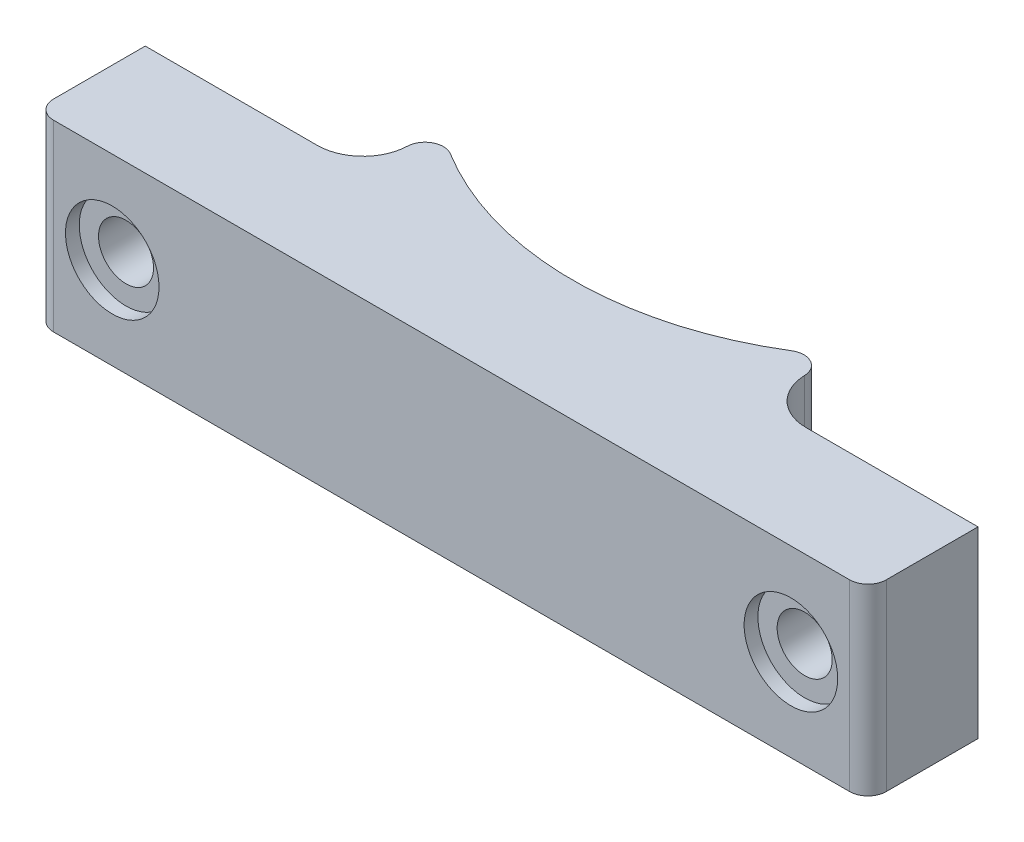
ISO-10303-21;
HEADER;
FILE_DESCRIPTION(('STEP AP214'),'2;1');
FILE_NAME('part.step','',(''),(''),'','','');
FILE_SCHEMA(('AUTOMOTIVE_DESIGN { 1 0 10303 214 1 1 1 1 }'));
ENDSEC;
DATA;
#1=APPLICATION_CONTEXT('core data for automotive mechanical design processes');
#2=APPLICATION_PROTOCOL_DEFINITION('international standard','automotive_design',2000,#1);
#3=PRODUCT_CONTEXT('',#1,'mechanical');
#4=PRODUCT('Part','Part','',(#3));
#5=PRODUCT_RELATED_PRODUCT_CATEGORY('part','',(#4));
#6=PRODUCT_DEFINITION_FORMATION('','',#4);
#7=PRODUCT_DEFINITION_CONTEXT('part definition',#1,'design');
#8=PRODUCT_DEFINITION('design','',#6,#7);
#9=PRODUCT_DEFINITION_SHAPE('','',#8);
#10=(LENGTH_UNIT() NAMED_UNIT(*) SI_UNIT(.MILLI.,.METRE.));
#11=(NAMED_UNIT(*) PLANE_ANGLE_UNIT() SI_UNIT($,.RADIAN.));
#12=(NAMED_UNIT(*) SI_UNIT($,.STERADIAN.) SOLID_ANGLE_UNIT());
#13=UNCERTAINTY_MEASURE_WITH_UNIT(LENGTH_MEASURE(1.E-05),#10,'distance_accuracy_value','');
#14=(GEOMETRIC_REPRESENTATION_CONTEXT(3) GLOBAL_UNCERTAINTY_ASSIGNED_CONTEXT((#13)) GLOBAL_UNIT_ASSIGNED_CONTEXT((#10,
#11,#12)) REPRESENTATION_CONTEXT('',''));
#15=CARTESIAN_POINT('',(0.,0.,0.));
#16=DIRECTION('',(0.,0.,1.));
#17=DIRECTION('',(1.,0.,0.));
#18=AXIS2_PLACEMENT_3D('',#15,#16,#17);
#19=CARTESIAN_POINT('',(-45.4,20.,0.));
#20=DIRECTION('',(1.,0.,0.));
#21=DIRECTION('',(0.,0.,-1.));
#22=AXIS2_PLACEMENT_3D('',#19,#20,#21);
#23=PLANE('',#22);
#24=DIRECTION('',(0.,0.,1.));
#25=VECTOR('',#24,1.);
#26=CARTESIAN_POINT('',(-45.4,0.,0.));
#27=LINE('',#26,#25);
#28=CARTESIAN_POINT('',(-45.4,0.,-12.));
#29=VERTEX_POINT('',#28);
#30=CARTESIAN_POINT('',(-45.4,0.,-1.99999999999999));
#31=VERTEX_POINT('',#30);
#32=EDGE_CURVE('E168',#29,#31,#27,.T.);
#33=ORIENTED_EDGE('',*,*,#32,.T.);
#34=DIRECTION('',(0.,-1.,0.));
#35=VECTOR('',#34,1.);
#36=CARTESIAN_POINT('',(-45.4,20.,-1.99999999999999));
#37=LINE('',#36,#35);
#38=CARTESIAN_POINT('',(-45.4,20.,-1.99999999999999));
#39=VERTEX_POINT('',#38);
#40=EDGE_CURVE('E11',#31,#39,#37,.F.);
#41=ORIENTED_EDGE('',*,*,#40,.T.);
#42=DIRECTION('',(0.,0.,1.));
#43=VECTOR('',#42,1.);
#44=CARTESIAN_POINT('',(-45.4,20.,0.));
#45=LINE('',#44,#43);
#46=CARTESIAN_POINT('',(-45.4,20.,-12.));
#47=VERTEX_POINT('',#46);
#48=EDGE_CURVE('E186',#47,#39,#45,.T.);
#49=ORIENTED_EDGE('',*,*,#48,.F.);
#50=DIRECTION('',(0.,-1.,0.));
#51=VECTOR('',#50,1.);
#52=CARTESIAN_POINT('',(-45.4,20.,-12.));
#53=LINE('',#52,#51);
#54=EDGE_CURVE('E167',#47,#29,#53,.T.);
#55=ORIENTED_EDGE('',*,*,#54,.T.);
#56=EDGE_LOOP('',(#33,#41,#49,#55));
#57=FACE_BOUND('',#56,.T.);
#58=ADVANCED_FACE('F39',(#57),#23,.F.);
#59=CARTESIAN_POINT('',(45.4,20.,0.));
#60=DIRECTION('',(0.,0.,-1.));
#61=DIRECTION('',(-1.,0.,0.));
#62=AXIS2_PLACEMENT_3D('',#59,#60,#61);
#63=PLANE('',#62);
#64=CARTESIAN_POINT('',(-37.,10.,0.));
#65=DIRECTION('',(0.,0.,1.));
#66=DIRECTION('',(1.,0.,0.));
#67=AXIS2_PLACEMENT_3D('',#64,#65,#66);
#68=CIRCLE('',#67,5.1);
#69=CARTESIAN_POINT('',(-31.9,10.,0.));
#70=VERTEX_POINT('',#69);
#71=EDGE_CURVE('E460',#70,#70,#68,.T.);
#72=ORIENTED_EDGE('',*,*,#71,.F.);
#73=EDGE_LOOP('',(#72));
#74=FACE_BOUND('',#73,.T.);
#75=CARTESIAN_POINT('',(37.,10.,0.));
#76=DIRECTION('',(0.,0.,1.));
#77=DIRECTION('',(1.,0.,0.));
#78=AXIS2_PLACEMENT_3D('',#75,#76,#77);
#79=CIRCLE('',#78,5.1);
#80=CARTESIAN_POINT('',(42.1,10.,0.));
#81=VERTEX_POINT('',#80);
#82=EDGE_CURVE('E217',#81,#81,#79,.T.);
#83=ORIENTED_EDGE('',*,*,#82,.F.);
#84=EDGE_LOOP('',(#83));
#85=FACE_BOUND('',#84,.T.);
#86=DIRECTION('',(1.,0.,0.));
#87=VECTOR('',#86,1.);
#88=CARTESIAN_POINT('',(45.4,0.,0.));
#89=LINE('',#88,#87);
#90=CARTESIAN_POINT('',(-43.4,0.,0.));
#91=VERTEX_POINT('',#90);
#92=CARTESIAN_POINT('',(43.4,0.,0.));
#93=VERTEX_POINT('',#92);
#94=EDGE_CURVE('E170',#91,#93,#89,.T.);
#95=ORIENTED_EDGE('',*,*,#94,.T.);
#96=DIRECTION('',(0.,-1.,0.));
#97=VECTOR('',#96,1.);
#98=CARTESIAN_POINT('',(43.4,20.,0.));
#99=LINE('',#98,#97);
#100=CARTESIAN_POINT('',(43.4,20.,0.));
#101=VERTEX_POINT('',#100);
#102=EDGE_CURVE('E60',#93,#101,#99,.F.);
#103=ORIENTED_EDGE('',*,*,#102,.T.);
#104=DIRECTION('',(1.,0.,0.));
#105=VECTOR('',#104,1.);
#106=CARTESIAN_POINT('',(45.4,20.,0.));
#107=LINE('',#106,#105);
#108=CARTESIAN_POINT('',(-43.4,20.,0.));
#109=VERTEX_POINT('',#108);
#110=EDGE_CURVE('E140',#109,#101,#107,.T.);
#111=ORIENTED_EDGE('',*,*,#110,.F.);
#112=DIRECTION('',(0.,-1.,0.));
#113=VECTOR('',#112,1.);
#114=CARTESIAN_POINT('',(-43.4,20.,0.));
#115=LINE('',#114,#113);
#116=EDGE_CURVE('E224',#109,#91,#115,.T.);
#117=ORIENTED_EDGE('',*,*,#116,.T.);
#118=EDGE_LOOP('',(#95,#103,#111,#117));
#119=FACE_BOUND('',#118,.T.);
#120=ADVANCED_FACE('F232',(#74,#85,#119),#63,.F.);
#121=CARTESIAN_POINT('',(45.4,20.,0.));
#122=DIRECTION('',(-1.,0.,0.));
#123=DIRECTION('',(0.,0.,1.));
#124=AXIS2_PLACEMENT_3D('',#121,#122,#123);
#125=PLANE('',#124);
#126=DIRECTION('',(0.,0.,-1.));
#127=VECTOR('',#126,1.);
#128=CARTESIAN_POINT('',(45.4,20.,0.));
#129=LINE('',#128,#127);
#130=CARTESIAN_POINT('',(45.4,20.,-1.99999999999999));
#131=VERTEX_POINT('',#130);
#132=CARTESIAN_POINT('',(45.4,20.,-12.));
#133=VERTEX_POINT('',#132);
#134=EDGE_CURVE('E129',#131,#133,#129,.T.);
#135=ORIENTED_EDGE('',*,*,#134,.F.);
#136=DIRECTION('',(0.,-1.,0.));
#137=VECTOR('',#136,1.);
#138=CARTESIAN_POINT('',(45.4,20.,-1.99999999999999));
#139=LINE('',#138,#137);
#140=CARTESIAN_POINT('',(45.4,0.,-1.99999999999999));
#141=VERTEX_POINT('',#140);
#142=EDGE_CURVE('E210',#131,#141,#139,.T.);
#143=ORIENTED_EDGE('',*,*,#142,.T.);
#144=DIRECTION('',(0.,0.,-1.));
#145=VECTOR('',#144,1.);
#146=CARTESIAN_POINT('',(45.4,0.,0.));
#147=LINE('',#146,#145);
#148=CARTESIAN_POINT('',(45.4,0.,-12.));
#149=VERTEX_POINT('',#148);
#150=EDGE_CURVE('E146',#141,#149,#147,.T.);
#151=ORIENTED_EDGE('',*,*,#150,.T.);
#152=DIRECTION('',(0.,-1.,0.));
#153=VECTOR('',#152,1.);
#154=CARTESIAN_POINT('',(45.4,20.,-12.));
#155=LINE('',#154,#153);
#156=EDGE_CURVE('E143',#133,#149,#155,.T.);
#157=ORIENTED_EDGE('',*,*,#156,.F.);
#158=EDGE_LOOP('',(#135,#143,#151,#157));
#159=FACE_BOUND('',#158,.T.);
#160=ADVANCED_FACE('F144',(#159),#125,.F.);
#161=CARTESIAN_POINT('',(45.4,20.,-12.));
#162=DIRECTION('',(0.,0.,1.));
#163=DIRECTION('',(1.,0.,0.));
#164=AXIS2_PLACEMENT_3D('',#161,#162,#163);
#165=PLANE('',#164);
#166=CARTESIAN_POINT('',(37.,10.,-12.));
#167=DIRECTION('',(0.,0.,1.));
#168=DIRECTION('',(1.,0.,0.));
#169=AXIS2_PLACEMENT_3D('',#166,#167,#168);
#170=CIRCLE('',#169,3.);
#171=CARTESIAN_POINT('',(40.,10.,-12.));
#172=VERTEX_POINT('',#171);
#173=EDGE_CURVE('E171',#172,#172,#170,.T.);
#174=ORIENTED_EDGE('',*,*,#173,.T.);
#175=EDGE_LOOP('',(#174));
#176=FACE_BOUND('',#175,.T.);
#177=DIRECTION('',(-1.,0.,0.));
#178=VECTOR('',#177,1.);
#179=CARTESIAN_POINT('',(45.4,0.,-12.));
#180=LINE('',#179,#178);
#181=CARTESIAN_POINT('',(26.65,0.,-12.));
#182=VERTEX_POINT('',#181);
#183=EDGE_CURVE('E174',#149,#182,#180,.T.);
#184=ORIENTED_EDGE('',*,*,#183,.T.);
#185=DIRECTION('',(0.,-1.,0.));
#186=VECTOR('',#185,1.);
#187=CARTESIAN_POINT('',(26.65,20.,-12.));
#188=LINE('',#187,#186);
#189=CARTESIAN_POINT('',(26.65,20.,-12.));
#190=VERTEX_POINT('',#189);
#191=EDGE_CURVE('E150',#190,#182,#188,.T.);
#192=ORIENTED_EDGE('',*,*,#191,.F.);
#193=DIRECTION('',(-1.,0.,0.));
#194=VECTOR('',#193,1.);
#195=CARTESIAN_POINT('',(45.4,20.,-12.));
#196=LINE('',#195,#194);
#197=EDGE_CURVE('E134',#133,#190,#196,.T.);
#198=ORIENTED_EDGE('',*,*,#197,.F.);
#199=ORIENTED_EDGE('',*,*,#156,.T.);
#200=EDGE_LOOP('',(#184,#192,#198,#199));
#201=FACE_BOUND('',#200,.T.);
#202=ADVANCED_FACE('F152',(#176,#201),#165,.F.);
#203=CARTESIAN_POINT('',(26.65,20.,-17.));
#204=DIRECTION('',(0.,-1.,0.));
#205=DIRECTION('',(0.,0.,-1.));
#206=AXIS2_PLACEMENT_3D('',#203,#204,#205);
#207=CYLINDRICAL_SURFACE('',#206,5.);
#208=CARTESIAN_POINT('',(26.65,0.,-17.));
#209=DIRECTION('',(0.,-1.,0.));
#210=DIRECTION('',(0.,0.,-1.));
#211=AXIS2_PLACEMENT_3D('',#208,#209,#210);
#212=CIRCLE('',#211,5.);
#213=CARTESIAN_POINT('',(21.6528657689305,0.,-16.8307384371067));
#214=VERTEX_POINT('',#213);
#215=EDGE_CURVE('E176',#182,#214,#212,.T.);
#216=ORIENTED_EDGE('',*,*,#215,.T.);
#217=DIRECTION('',(0.,-1.,0.));
#218=VECTOR('',#217,1.);
#219=CARTESIAN_POINT('',(21.6528657689305,20.,-16.8307384371067));
#220=LINE('',#219,#218);
#221=CARTESIAN_POINT('',(21.6528657689305,20.,-16.8307384371067));
#222=VERTEX_POINT('',#221);
#223=EDGE_CURVE('E201',#214,#222,#220,.F.);
#224=ORIENTED_EDGE('',*,*,#223,.T.);
#225=CARTESIAN_POINT('',(26.65,20.,-17.));
#226=DIRECTION('',(0.,-1.,0.));
#227=DIRECTION('',(0.,0.,-1.));
#228=AXIS2_PLACEMENT_3D('',#225,#226,#227);
#229=CIRCLE('',#228,5.);
#230=EDGE_CURVE('E155',#190,#222,#229,.T.);
#231=ORIENTED_EDGE('',*,*,#230,.F.);
#232=ORIENTED_EDGE('',*,*,#191,.T.);
#233=EDGE_LOOP('',(#216,#224,#231,#232));
#234=FACE_BOUND('',#233,.T.);
#235=ADVANCED_FACE('F263',(#234),#207,.F.);
#236=CARTESIAN_POINT('',(0.,20.,-48.7));
#237=DIRECTION('',(0.,-1.,0.));
#238=DIRECTION('',(0.,0.,-1.));
#239=AXIS2_PLACEMENT_3D('',#236,#237,#238);
#240=CYLINDRICAL_SURFACE('',#239,35.5);
#241=CARTESIAN_POINT('',(0.,20.,-48.7));
#242=DIRECTION('',(0.,-1.,0.));
#243=DIRECTION('',(0.,0.,1.));
#244=AXIS2_PLACEMENT_3D('',#241,#242,#243);
#245=CIRCLE('',#244,35.5);
#246=CARTESIAN_POINT('',(18.6057980990891,20.,-18.4663386753121));
#247=VERTEX_POINT('',#246);
#248=CARTESIAN_POINT('',(-18.6057980990892,20.,-18.4663386753121));
#249=VERTEX_POINT('',#248);
#250=EDGE_CURVE('E157',#247,#249,#245,.T.);
#251=ORIENTED_EDGE('',*,*,#250,.F.);
#252=DIRECTION('',(0.,-1.,0.));
#253=VECTOR('',#252,1.);
#254=CARTESIAN_POINT('',(18.6057980990891,20.,-18.4663386753121));
#255=LINE('',#254,#253);
#256=CARTESIAN_POINT('',(18.6057980990891,0.,-18.4663386753121));
#257=VERTEX_POINT('',#256);
#258=EDGE_CURVE('E194',#247,#257,#255,.T.);
#259=ORIENTED_EDGE('',*,*,#258,.T.);
#260=CARTESIAN_POINT('',(0.,0.,-48.7));
#261=DIRECTION('',(0.,-1.,0.));
#262=DIRECTION('',(0.,0.,1.));
#263=AXIS2_PLACEMENT_3D('',#260,#261,#262);
#264=CIRCLE('',#263,35.5);
#265=CARTESIAN_POINT('',(-18.6057980990892,0.,-18.4663386753121));
#266=VERTEX_POINT('',#265);
#267=EDGE_CURVE('E179',#257,#266,#264,.T.);
#268=ORIENTED_EDGE('',*,*,#267,.T.);
#269=DIRECTION('',(0.,-1.,0.));
#270=VECTOR('',#269,1.);
#271=CARTESIAN_POINT('',(-18.6057980990892,20.,-18.4663386753121));
#272=LINE('',#271,#270);
#273=EDGE_CURVE('E149',#266,#249,#272,.F.);
#274=ORIENTED_EDGE('',*,*,#273,.T.);
#275=EDGE_LOOP('',(#251,#259,#268,#274));
#276=FACE_BOUND('',#275,.T.);
#277=ADVANCED_FACE('F255',(#276),#240,.F.);
#278=CARTESIAN_POINT('',(-26.65,20.,-17.));
#279=DIRECTION('',(0.,-1.,0.));
#280=DIRECTION('',(0.,0.,-1.));
#281=AXIS2_PLACEMENT_3D('',#278,#279,#280);
#282=CYLINDRICAL_SURFACE('',#281,5.);
#283=CARTESIAN_POINT('',(-26.65,20.,-17.));
#284=DIRECTION('',(0.,-1.,0.));
#285=DIRECTION('',(0.,0.,1.));
#286=AXIS2_PLACEMENT_3D('',#283,#284,#285);
#287=CIRCLE('',#286,5.);
#288=CARTESIAN_POINT('',(-21.6528657689305,20.,-16.8307384371067));
#289=VERTEX_POINT('',#288);
#290=CARTESIAN_POINT('',(-26.65,20.,-12.));
#291=VERTEX_POINT('',#290);
#292=EDGE_CURVE('E163',#289,#291,#287,.T.);
#293=ORIENTED_EDGE('',*,*,#292,.F.);
#294=DIRECTION('',(0.,-1.,0.));
#295=VECTOR('',#294,1.);
#296=CARTESIAN_POINT('',(-21.6528657689305,20.,-16.8307384371067));
#297=LINE('',#296,#295);
#298=CARTESIAN_POINT('',(-21.6528657689305,0.,-16.8307384371067));
#299=VERTEX_POINT('',#298);
#300=EDGE_CURVE('E207',#289,#299,#297,.T.);
#301=ORIENTED_EDGE('',*,*,#300,.T.);
#302=CARTESIAN_POINT('',(-26.65,0.,-17.));
#303=DIRECTION('',(0.,-1.,0.));
#304=DIRECTION('',(0.,0.,1.));
#305=AXIS2_PLACEMENT_3D('',#302,#303,#304);
#306=CIRCLE('',#305,5.);
#307=CARTESIAN_POINT('',(-26.65,0.,-12.));
#308=VERTEX_POINT('',#307);
#309=EDGE_CURVE('E182',#299,#308,#306,.T.);
#310=ORIENTED_EDGE('',*,*,#309,.T.);
#311=DIRECTION('',(0.,-1.,0.));
#312=VECTOR('',#311,1.);
#313=CARTESIAN_POINT('',(-26.65,20.,-12.));
#314=LINE('',#313,#312);
#315=EDGE_CURVE('E189',#291,#308,#314,.T.);
#316=ORIENTED_EDGE('',*,*,#315,.F.);
#317=EDGE_LOOP('',(#293,#301,#310,#316));
#318=FACE_BOUND('',#317,.T.);
#319=ADVANCED_FACE('F247',(#318),#282,.F.);
#320=CARTESIAN_POINT('',(-45.4,20.,-12.));
#321=DIRECTION('',(0.,0.,1.));
#322=DIRECTION('',(1.,0.,0.));
#323=AXIS2_PLACEMENT_3D('',#320,#321,#322);
#324=PLANE('',#323);
#325=CARTESIAN_POINT('',(-37.,10.,-12.));
#326=DIRECTION('',(0.,0.,1.));
#327=DIRECTION('',(1.,0.,0.));
#328=AXIS2_PLACEMENT_3D('',#325,#326,#327);
#329=CIRCLE('',#328,3.);
#330=CARTESIAN_POINT('',(-34.,10.,-12.));
#331=VERTEX_POINT('',#330);
#332=EDGE_CURVE('E214',#331,#331,#329,.T.);
#333=ORIENTED_EDGE('',*,*,#332,.T.);
#334=EDGE_LOOP('',(#333));
#335=FACE_BOUND('',#334,.T.);
#336=DIRECTION('',(-1.,0.,0.));
#337=VECTOR('',#336,1.);
#338=CARTESIAN_POINT('',(-45.4,0.,-12.));
#339=LINE('',#338,#337);
#340=EDGE_CURVE('E184',#308,#29,#339,.T.);
#341=ORIENTED_EDGE('',*,*,#340,.T.);
#342=ORIENTED_EDGE('',*,*,#54,.F.);
#343=DIRECTION('',(-1.,0.,0.));
#344=VECTOR('',#343,1.);
#345=CARTESIAN_POINT('',(-45.4,20.,-12.));
#346=LINE('',#345,#344);
#347=EDGE_CURVE('E165',#291,#47,#346,.T.);
#348=ORIENTED_EDGE('',*,*,#347,.F.);
#349=ORIENTED_EDGE('',*,*,#315,.T.);
#350=EDGE_LOOP('',(#341,#342,#348,#349));
#351=FACE_BOUND('',#350,.T.);
#352=ADVANCED_FACE('F241',(#335,#351),#324,.F.);
#353=CARTESIAN_POINT('',(-26.65,20.,-17.));
#354=DIRECTION('',(0.,1.,0.));
#355=DIRECTION('',(0.,0.,1.));
#356=AXIS2_PLACEMENT_3D('',#353,#354,#355);
#357=PLANE('',#356);
#358=ORIENTED_EDGE('',*,*,#110,.T.);
#359=CARTESIAN_POINT('',(43.4,20.,-1.99999999999999));
#360=DIRECTION('',(0.,1.,0.));
#361=DIRECTION('',(0.,0.,1.));
#362=AXIS2_PLACEMENT_3D('',#359,#360,#361);
#363=CIRCLE('',#362,2.);
#364=EDGE_CURVE('E47',#101,#131,#363,.T.);
#365=ORIENTED_EDGE('',*,*,#364,.T.);
#366=ORIENTED_EDGE('',*,*,#134,.T.);
#367=ORIENTED_EDGE('',*,*,#197,.T.);
#368=ORIENTED_EDGE('',*,*,#230,.T.);
#369=CARTESIAN_POINT('',(19.6540120765026,20.,-16.7630338119494));
#370=DIRECTION('',(0.,1.,0.));
#371=DIRECTION('',(0.,0.,1.));
#372=AXIS2_PLACEMENT_3D('',#369,#370,#371);
#373=CIRCLE('',#372,2.);
#374=EDGE_CURVE('E205',#222,#247,#373,.T.);
#375=ORIENTED_EDGE('',*,*,#374,.T.);
#376=ORIENTED_EDGE('',*,*,#250,.T.);
#377=CARTESIAN_POINT('',(-19.6540120765026,20.,-16.7630338119494));
#378=DIRECTION('',(0.,1.,0.));
#379=DIRECTION('',(0.,0.,1.));
#380=AXIS2_PLACEMENT_3D('',#377,#378,#379);
#381=CIRCLE('',#380,2.);
#382=EDGE_CURVE('E203',#249,#289,#381,.T.);
#383=ORIENTED_EDGE('',*,*,#382,.T.);
#384=ORIENTED_EDGE('',*,*,#292,.T.);
#385=ORIENTED_EDGE('',*,*,#347,.T.);
#386=ORIENTED_EDGE('',*,*,#48,.T.);
#387=CARTESIAN_POINT('',(-43.4,20.,-1.99999999999999));
#388=DIRECTION('',(0.,1.,0.));
#389=DIRECTION('',(0.,0.,1.));
#390=AXIS2_PLACEMENT_3D('',#387,#388,#389);
#391=CIRCLE('',#390,2.);
#392=EDGE_CURVE('E228',#39,#109,#391,.T.);
#393=ORIENTED_EDGE('',*,*,#392,.T.);
#394=EDGE_LOOP('',(#358,#365,#366,#367,#368,#375,#376,#383,#384,#385,#386,#393));
#395=FACE_BOUND('',#394,.T.);
#396=ADVANCED_FACE('F131',(#395),#357,.T.);
#397=CARTESIAN_POINT('',(-26.65,0.,-17.));
#398=DIRECTION('',(0.,1.,0.));
#399=DIRECTION('',(0.,0.,1.));
#400=AXIS2_PLACEMENT_3D('',#397,#398,#399);
#401=PLANE('',#400);
#402=ORIENTED_EDGE('',*,*,#150,.F.);
#403=CARTESIAN_POINT('',(43.4,0.,-1.99999999999999));
#404=DIRECTION('',(0.,1.,0.));
#405=DIRECTION('',(0.,0.,1.));
#406=AXIS2_PLACEMENT_3D('',#403,#404,#405);
#407=CIRCLE('',#406,2.);
#408=EDGE_CURVE('E222',#141,#93,#407,.F.);
#409=ORIENTED_EDGE('',*,*,#408,.T.);
#410=ORIENTED_EDGE('',*,*,#94,.F.);
#411=CARTESIAN_POINT('',(-43.4,0.,-1.99999999999999));
#412=DIRECTION('',(0.,1.,0.));
#413=DIRECTION('',(0.,0.,1.));
#414=AXIS2_PLACEMENT_3D('',#411,#412,#413);
#415=CIRCLE('',#414,2.);
#416=EDGE_CURVE('E220',#91,#31,#415,.F.);
#417=ORIENTED_EDGE('',*,*,#416,.T.);
#418=ORIENTED_EDGE('',*,*,#32,.F.);
#419=ORIENTED_EDGE('',*,*,#340,.F.);
#420=ORIENTED_EDGE('',*,*,#309,.F.);
#421=CARTESIAN_POINT('',(-19.6540120765026,0.,-16.7630338119494));
#422=DIRECTION('',(0.,1.,0.));
#423=DIRECTION('',(0.,0.,1.));
#424=AXIS2_PLACEMENT_3D('',#421,#422,#423);
#425=CIRCLE('',#424,2.);
#426=EDGE_CURVE('E197',#299,#266,#425,.F.);
#427=ORIENTED_EDGE('',*,*,#426,.T.);
#428=ORIENTED_EDGE('',*,*,#267,.F.);
#429=CARTESIAN_POINT('',(19.6540120765026,0.,-16.7630338119494));
#430=DIRECTION('',(0.,1.,0.));
#431=DIRECTION('',(0.,0.,1.));
#432=AXIS2_PLACEMENT_3D('',#429,#430,#431);
#433=CIRCLE('',#432,2.);
#434=EDGE_CURVE('E199',#257,#214,#433,.F.);
#435=ORIENTED_EDGE('',*,*,#434,.T.);
#436=ORIENTED_EDGE('',*,*,#215,.F.);
#437=ORIENTED_EDGE('',*,*,#183,.F.);
#438=EDGE_LOOP('',(#402,#409,#410,#417,#418,#419,#420,#427,#428,#435,#436,#437));
#439=FACE_BOUND('',#438,.T.);
#440=ADVANCED_FACE('F236',(#439),#401,.F.);
#441=CARTESIAN_POINT('',(19.6540120765026,20.,-16.7630338119494));
#442=DIRECTION('',(0.,-1.,0.));
#443=DIRECTION('',(0.,0.,-1.));
#444=AXIS2_PLACEMENT_3D('',#441,#442,#443);
#445=CYLINDRICAL_SURFACE('',#444,2.);
#446=ORIENTED_EDGE('',*,*,#374,.F.);
#447=ORIENTED_EDGE('',*,*,#223,.F.);
#448=ORIENTED_EDGE('',*,*,#434,.F.);
#449=ORIENTED_EDGE('',*,*,#258,.F.);
#450=EDGE_LOOP('',(#446,#447,#448,#449));
#451=FACE_BOUND('',#450,.T.);
#452=ADVANCED_FACE('F260',(#451),#445,.T.);
#453=CARTESIAN_POINT('',(-19.6540120765026,20.,-16.7630338119494));
#454=DIRECTION('',(0.,-1.,0.));
#455=DIRECTION('',(0.,0.,-1.));
#456=AXIS2_PLACEMENT_3D('',#453,#454,#455);
#457=CYLINDRICAL_SURFACE('',#456,2.);
#458=ORIENTED_EDGE('',*,*,#382,.F.);
#459=ORIENTED_EDGE('',*,*,#273,.F.);
#460=ORIENTED_EDGE('',*,*,#426,.F.);
#461=ORIENTED_EDGE('',*,*,#300,.F.);
#462=EDGE_LOOP('',(#458,#459,#460,#461));
#463=FACE_BOUND('',#462,.T.);
#464=ADVANCED_FACE('F251',(#463),#457,.T.);
#465=CARTESIAN_POINT('',(37.,10.,0.));
#466=DIRECTION('',(0.,0.,1.));
#467=DIRECTION('',(1.,0.,0.));
#468=AXIS2_PLACEMENT_3D('',#465,#466,#467);
#469=CYLINDRICAL_SURFACE('',#468,3.);
#470=CARTESIAN_POINT('',(37.,10.,-1.5));
#471=DIRECTION('',(0.,0.,1.));
#472=DIRECTION('',(1.,0.,0.));
#473=AXIS2_PLACEMENT_3D('',#470,#471,#472);
#474=CIRCLE('',#473,3.);
#475=CARTESIAN_POINT('',(40.,10.,-1.5));
#476=VERTEX_POINT('',#475);
#477=EDGE_CURVE('E213',#476,#476,#474,.T.);
#478=ORIENTED_EDGE('',*,*,#477,.T.);
#479=EDGE_LOOP('',(#478));
#480=FACE_BOUND('',#479,.T.);
#481=ORIENTED_EDGE('',*,*,#173,.F.);
#482=EDGE_LOOP('',(#481));
#483=FACE_BOUND('',#482,.T.);
#484=ADVANCED_FACE('F286',(#480,#483),#469,.F.);
#485=CARTESIAN_POINT('',(40.,10.,-1.5));
#486=DIRECTION('',(0.,0.,-1.));
#487=DIRECTION('',(-1.,0.,0.));
#488=AXIS2_PLACEMENT_3D('',#485,#486,#487);
#489=PLANE('',#488);
#490=ORIENTED_EDGE('',*,*,#477,.F.);
#491=EDGE_LOOP('',(#490));
#492=FACE_BOUND('',#491,.T.);
#493=CARTESIAN_POINT('',(37.,10.,-1.5));
#494=DIRECTION('',(0.,0.,1.));
#495=DIRECTION('',(1.,0.,0.));
#496=AXIS2_PLACEMENT_3D('',#493,#494,#495);
#497=CIRCLE('',#496,5.1);
#498=CARTESIAN_POINT('',(42.1,10.,-1.5));
#499=VERTEX_POINT('',#498);
#500=EDGE_CURVE('E447',#499,#499,#497,.T.);
#501=ORIENTED_EDGE('',*,*,#500,.T.);
#502=EDGE_LOOP('',(#501));
#503=FACE_BOUND('',#502,.T.);
#504=ADVANCED_FACE('F313',(#492,#503),#489,.F.);
#505=CARTESIAN_POINT('',(37.,10.,0.));
#506=DIRECTION('',(0.,0.,1.));
#507=DIRECTION('',(1.,0.,0.));
#508=AXIS2_PLACEMENT_3D('',#505,#506,#507);
#509=CYLINDRICAL_SURFACE('',#508,5.1);
#510=ORIENTED_EDGE('',*,*,#500,.F.);
#511=EDGE_LOOP('',(#510));
#512=FACE_BOUND('',#511,.T.);
#513=ORIENTED_EDGE('',*,*,#82,.T.);
#514=EDGE_LOOP('',(#513));
#515=FACE_BOUND('',#514,.T.);
#516=ADVANCED_FACE('F309',(#512,#515),#509,.F.);
#517=CARTESIAN_POINT('',(-37.,10.,0.));
#518=DIRECTION('',(0.,0.,1.));
#519=DIRECTION('',(1.,0.,0.));
#520=AXIS2_PLACEMENT_3D('',#517,#518,#519);
#521=CYLINDRICAL_SURFACE('',#520,3.);
#522=CARTESIAN_POINT('',(-37.,10.,-1.5));
#523=DIRECTION('',(0.,0.,1.));
#524=DIRECTION('',(1.,0.,0.));
#525=AXIS2_PLACEMENT_3D('',#522,#523,#524);
#526=CIRCLE('',#525,3.);
#527=CARTESIAN_POINT('',(-34.,10.,-1.5));
#528=VERTEX_POINT('',#527);
#529=EDGE_CURVE('E218',#528,#528,#526,.T.);
#530=ORIENTED_EDGE('',*,*,#529,.T.);
#531=EDGE_LOOP('',(#530));
#532=FACE_BOUND('',#531,.T.);
#533=ORIENTED_EDGE('',*,*,#332,.F.);
#534=EDGE_LOOP('',(#533));
#535=FACE_BOUND('',#534,.T.);
#536=ADVANCED_FACE('F301',(#532,#535),#521,.F.);
#537=CARTESIAN_POINT('',(-34.,10.,-1.5));
#538=DIRECTION('',(0.,0.,-1.));
#539=DIRECTION('',(-1.,0.,0.));
#540=AXIS2_PLACEMENT_3D('',#537,#538,#539);
#541=PLANE('',#540);
#542=ORIENTED_EDGE('',*,*,#529,.F.);
#543=EDGE_LOOP('',(#542));
#544=FACE_BOUND('',#543,.T.);
#545=CARTESIAN_POINT('',(-37.,10.,-1.5));
#546=DIRECTION('',(0.,0.,1.));
#547=DIRECTION('',(1.,0.,0.));
#548=AXIS2_PLACEMENT_3D('',#545,#546,#547);
#549=CIRCLE('',#548,5.1);
#550=CARTESIAN_POINT('',(-31.9,10.,-1.5));
#551=VERTEX_POINT('',#550);
#552=EDGE_CURVE('E457',#551,#551,#549,.T.);
#553=ORIENTED_EDGE('',*,*,#552,.T.);
#554=EDGE_LOOP('',(#553));
#555=FACE_BOUND('',#554,.T.);
#556=ADVANCED_FACE('F295',(#544,#555),#541,.F.);
#557=CARTESIAN_POINT('',(-37.,10.,0.));
#558=DIRECTION('',(0.,0.,1.));
#559=DIRECTION('',(1.,0.,0.));
#560=AXIS2_PLACEMENT_3D('',#557,#558,#559);
#561=CYLINDRICAL_SURFACE('',#560,5.1);
#562=ORIENTED_EDGE('',*,*,#552,.F.);
#563=EDGE_LOOP('',(#562));
#564=FACE_BOUND('',#563,.T.);
#565=ORIENTED_EDGE('',*,*,#71,.T.);
#566=EDGE_LOOP('',(#565));
#567=FACE_BOUND('',#566,.T.);
#568=ADVANCED_FACE('F289',(#564,#567),#561,.F.);
#569=CARTESIAN_POINT('',(43.4,20.,-1.99999999999999));
#570=DIRECTION('',(0.,-1.,0.));
#571=DIRECTION('',(0.,0.,-1.));
#572=AXIS2_PLACEMENT_3D('',#569,#570,#571);
#573=CYLINDRICAL_SURFACE('',#572,2.);
#574=ORIENTED_EDGE('',*,*,#364,.F.);
#575=ORIENTED_EDGE('',*,*,#102,.F.);
#576=ORIENTED_EDGE('',*,*,#408,.F.);
#577=ORIENTED_EDGE('',*,*,#142,.F.);
#578=EDGE_LOOP('',(#574,#575,#576,#577));
#579=FACE_BOUND('',#578,.T.);
#580=ADVANCED_FACE('F287',(#579),#573,.T.);
#581=CARTESIAN_POINT('',(-43.4,20.,-1.99999999999999));
#582=DIRECTION('',(0.,-1.,0.));
#583=DIRECTION('',(0.,0.,-1.));
#584=AXIS2_PLACEMENT_3D('',#581,#582,#583);
#585=CYLINDRICAL_SURFACE('',#584,2.);
#586=ORIENTED_EDGE('',*,*,#392,.F.);
#587=ORIENTED_EDGE('',*,*,#40,.F.);
#588=ORIENTED_EDGE('',*,*,#416,.F.);
#589=ORIENTED_EDGE('',*,*,#116,.F.);
#590=EDGE_LOOP('',(#586,#587,#588,#589));
#591=FACE_BOUND('',#590,.T.);
#592=ADVANCED_FACE('F41',(#591),#585,.T.);
#593=CLOSED_SHELL('',(#58,#120,#160,#202,#235,#277,#319,#352,#396,#440,#452,#464,#484,#504,#516,
#536,#556,#568,#580,#592));
#594=MANIFOLD_SOLID_BREP('B2',#593);
#595=ADVANCED_BREP_SHAPE_REPRESENTATION('',(#18,#594),#14);
#596=SHAPE_DEFINITION_REPRESENTATION(#9,#595);
ENDSEC;
END-ISO-10303-21;
